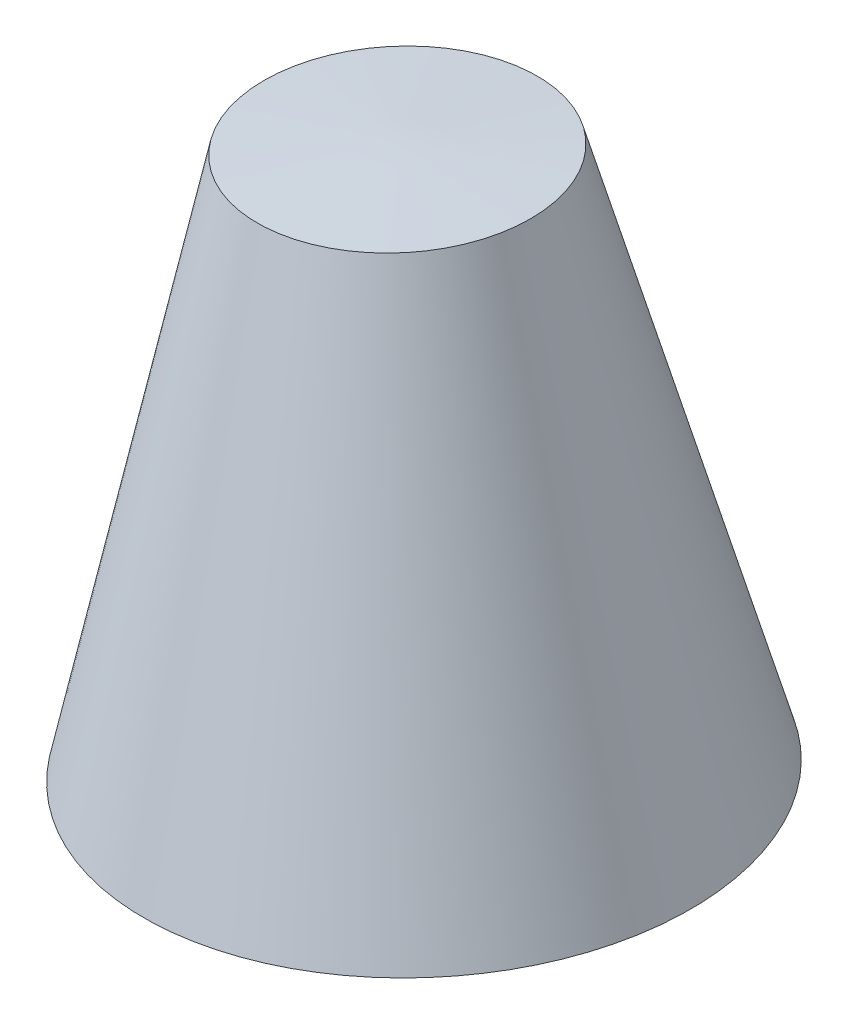
ISO-10303-21;
HEADER;
FILE_DESCRIPTION(('STEP AP214'),'2;1');
FILE_NAME('part.step','',(''),(''),'','','');
FILE_SCHEMA(('AUTOMOTIVE_DESIGN { 1 0 10303 214 1 1 1 1 }'));
ENDSEC;
DATA;
#1=APPLICATION_CONTEXT('core data for automotive mechanical design processes');
#2=APPLICATION_PROTOCOL_DEFINITION('international standard','automotive_design',2000,#1);
#3=PRODUCT_CONTEXT('',#1,'mechanical');
#4=PRODUCT('Part','Part','',(#3));
#5=PRODUCT_RELATED_PRODUCT_CATEGORY('part','',(#4));
#6=PRODUCT_DEFINITION_FORMATION('','',#4);
#7=PRODUCT_DEFINITION_CONTEXT('part definition',#1,'design');
#8=PRODUCT_DEFINITION('design','',#6,#7);
#9=PRODUCT_DEFINITION_SHAPE('','',#8);
#10=(LENGTH_UNIT() NAMED_UNIT(*) SI_UNIT(.MILLI.,.METRE.));
#11=(NAMED_UNIT(*) PLANE_ANGLE_UNIT() SI_UNIT($,.RADIAN.));
#12=(NAMED_UNIT(*) SI_UNIT($,.STERADIAN.) SOLID_ANGLE_UNIT());
#13=UNCERTAINTY_MEASURE_WITH_UNIT(LENGTH_MEASURE(1.E-05),#10,'distance_accuracy_value','');
#14=(GEOMETRIC_REPRESENTATION_CONTEXT(3) GLOBAL_UNCERTAINTY_ASSIGNED_CONTEXT((#13)) GLOBAL_UNIT_ASSIGNED_CONTEXT((#10,
#11,#12)) REPRESENTATION_CONTEXT('',''));
#15=CARTESIAN_POINT('',(0.,0.,0.));
#16=DIRECTION('',(0.,0.,1.));
#17=DIRECTION('',(1.,0.,0.));
#18=AXIS2_PLACEMENT_3D('',#15,#16,#17);
#19=CARTESIAN_POINT('',(-25.7288377639244,61.457817409874,0.));
#20=DIRECTION('',(0.0506595063767953,-0.998715982856818,0.));
#21=DIRECTION('',(0.998715982856818,0.0506595063767953,0.));
#22=AXIS2_PLACEMENT_3D('',#19,#20,#21);
#23=CONICAL_SURFACE('',#22,18.8010915452698,1.52011512671744);
#24=CARTESIAN_POINT('',(-25.7771506488461,62.4102714269023,0.));
#25=VERTEX_POINT('',#24);
#26=VERTEX_LOOP('',#25);
#27=FACE_BOUND('',#26,.T.);
#28=CARTESIAN_POINT('',(-25.7288377639244,61.457817409874,0.));
#29=DIRECTION('',(-0.0506595063767953,0.998715982856818,0.));
#30=DIRECTION('',(-0.998715982856818,-0.0506595063767953,0.));
#31=AXIS2_PLACEMENT_3D('',#28,#29,#30);
#32=CIRCLE('',#31,18.8010915452698);
#33=CARTESIAN_POINT('',(-44.5057883853395,60.5053633928457,0.));
#34=VERTEX_POINT('',#33);
#35=EDGE_CURVE('E47',#34,#34,#32,.T.);
#36=ORIENTED_EDGE('',*,*,#35,.T.);
#37=EDGE_LOOP('',(#36));
#38=FACE_BOUND('',#37,.T.);
#39=ADVANCED_FACE('F41',(#27,#38),#23,.T.);
#40=CARTESIAN_POINT('',(-21.9798642535399,-12.4505175091342,0.));
#41=DIRECTION('',(-0.0506595063767953,0.998715982856818,0.));
#42=DIRECTION('',(-0.998715982856818,-0.0506595063767953,0.));
#43=AXIS2_PLACEMENT_3D('',#40,#41,#42);
#44=PLANE('',#43);
#45=CARTESIAN_POINT('',(-21.9798642535399,-12.4505175091342,0.));
#46=DIRECTION('',(-0.0506595063767953,0.998715982856818,0.));
#47=DIRECTION('',(-0.998715982856818,-0.0506595063767953,0.));
#48=AXIS2_PLACEMENT_3D('',#45,#46,#47);
#49=CIRCLE('',#48,37.6021830905396);
#50=CARTESIAN_POINT('',(-59.5337654963701,-14.3554255431908,0.));
#51=VERTEX_POINT('',#50);
#52=EDGE_CURVE('E11',#51,#51,#49,.T.);
#53=ORIENTED_EDGE('',*,*,#52,.F.);
#54=EDGE_LOOP('',(#53));
#55=FACE_BOUND('',#54,.T.);
#56=ADVANCED_FACE('F52',(#55),#44,.F.);
#57=CARTESIAN_POINT('',(-21.9798642535399,-12.4505175091342,0.));
#58=DIRECTION('',(0.0506595063767953,-0.998715982856818,0.));
#59=DIRECTION('',(0.998715982856818,0.0506595063767953,0.));
#60=AXIS2_PLACEMENT_3D('',#57,#58,#59);
#61=CONICAL_SURFACE('',#60,37.6021830905396,0.248793620158124);
#62=ORIENTED_EDGE('',*,*,#35,.F.);
#63=EDGE_LOOP('',(#62));
#64=FACE_BOUND('',#63,.T.);
#65=ORIENTED_EDGE('',*,*,#52,.T.);
#66=EDGE_LOOP('',(#65));
#67=FACE_BOUND('',#66,.T.);
#68=ADVANCED_FACE('F56',(#64,#67),#61,.T.);
#69=CLOSED_SHELL('',(#39,#56,#68));
#70=MANIFOLD_SOLID_BREP('B2',#69);
#71=ADVANCED_BREP_SHAPE_REPRESENTATION('',(#18,#70),#14);
#72=SHAPE_DEFINITION_REPRESENTATION(#9,#71);
ENDSEC;
END-ISO-10303-21;
